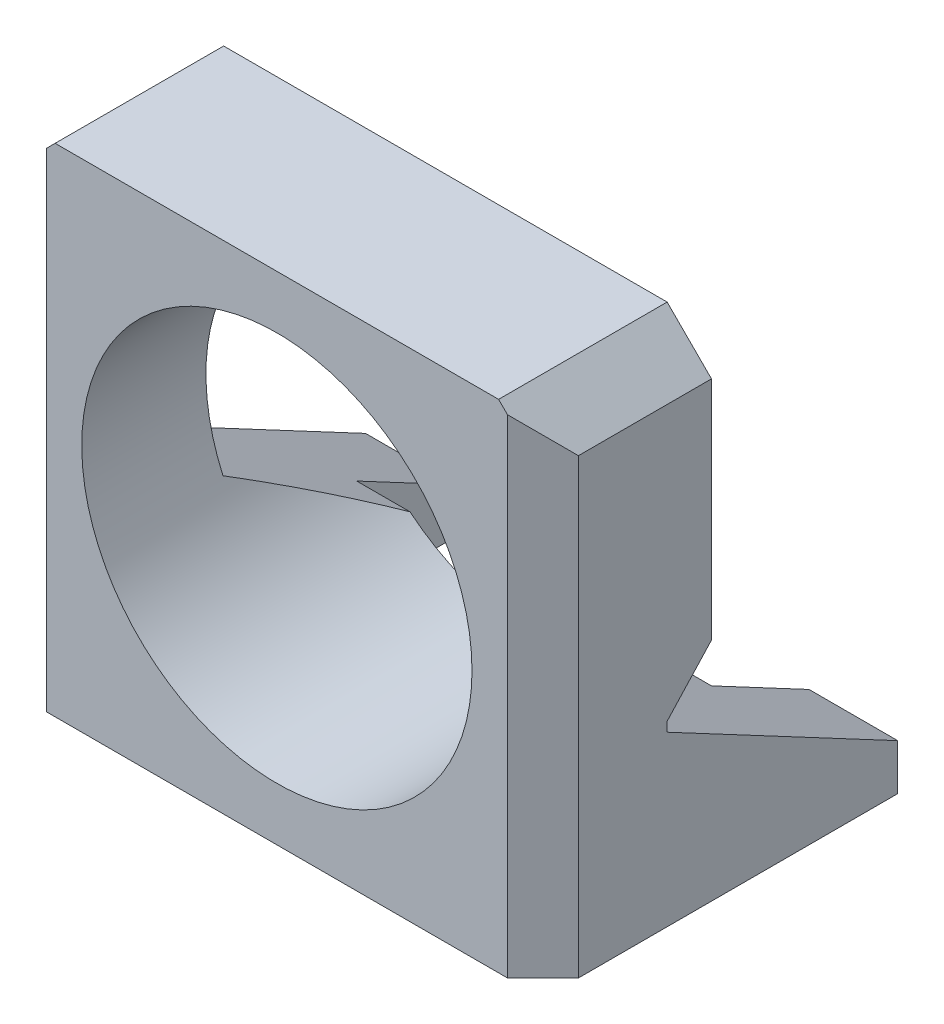
ISO-10303-21;
HEADER;
FILE_DESCRIPTION(('STEP AP214'),'2;1');
FILE_NAME('part.step','',(''),(''),'','','');
FILE_SCHEMA(('AUTOMOTIVE_DESIGN { 1 0 10303 214 1 1 1 1 }'));
ENDSEC;
DATA;
#1=APPLICATION_CONTEXT('core data for automotive mechanical design processes');
#2=APPLICATION_PROTOCOL_DEFINITION('international standard','automotive_design',2000,#1);
#3=PRODUCT_CONTEXT('',#1,'mechanical');
#4=PRODUCT('Part','Part','',(#3));
#5=PRODUCT_RELATED_PRODUCT_CATEGORY('part','',(#4));
#6=PRODUCT_DEFINITION_FORMATION('','',#4);
#7=PRODUCT_DEFINITION_CONTEXT('part definition',#1,'design');
#8=PRODUCT_DEFINITION('design','',#6,#7);
#9=PRODUCT_DEFINITION_SHAPE('','',#8);
#10=(LENGTH_UNIT() NAMED_UNIT(*) SI_UNIT(.MILLI.,.METRE.));
#11=(NAMED_UNIT(*) PLANE_ANGLE_UNIT() SI_UNIT($,.RADIAN.));
#12=(NAMED_UNIT(*) SI_UNIT($,.STERADIAN.) SOLID_ANGLE_UNIT());
#13=UNCERTAINTY_MEASURE_WITH_UNIT(LENGTH_MEASURE(1.E-05),#10,'distance_accuracy_value','');
#14=(GEOMETRIC_REPRESENTATION_CONTEXT(3) GLOBAL_UNCERTAINTY_ASSIGNED_CONTEXT((#13)) GLOBAL_UNIT_ASSIGNED_CONTEXT((#10,
#11,#12)) REPRESENTATION_CONTEXT('',''));
#15=CARTESIAN_POINT('',(0.,0.,0.));
#16=DIRECTION('',(0.,0.,1.));
#17=DIRECTION('',(1.,0.,0.));
#18=AXIS2_PLACEMENT_3D('',#15,#16,#17);
#19=CARTESIAN_POINT('',(-15.,-11.5,-13.1650852574246));
#20=DIRECTION('',(0.,0.882947592858929,-0.469471562785888));
#21=DIRECTION('',(-1.,0.,0.));
#22=AXIS2_PLACEMENT_3D('',#19,#20,#21);
#23=PLANE('',#22);
#24=DIRECTION('',(-1.,0.,0.));
#25=VECTOR('',#24,1.);
#26=CARTESIAN_POINT('',(-15.,-8.48782073746096,-7.5));
#27=LINE('',#26,#25);
#28=CARTESIAN_POINT('',(6.99692068904083,-8.48782073746097,-7.50000000000001));
#29=VERTEX_POINT('',#28);
#30=CARTESIAN_POINT('',(10.,-8.48782073746096,-7.50000000000001));
#31=VERTEX_POINT('',#30);
#32=EDGE_CURVE('E292',#29,#31,#27,.F.);
#33=ORIENTED_EDGE('',*,*,#32,.F.);
#34=CARTESIAN_POINT('',(0.,0.,8.46326909405839));
#35=DIRECTION('',(0.,0.882947592858929,-0.469471562785888));
#36=DIRECTION('',(0.,-0.469471562785888,-0.882947592858929));
#37=AXIS2_PLACEMENT_3D('',#34,#35,#36);
#38=ELLIPSE('',#37,23.4305991500848,11.);
#39=CARTESIAN_POINT('',(10.0374299499424,-4.49999999999991,0.));
#40=VERTEX_POINT('',#39);
#41=EDGE_CURVE('E302',#40,#29,#38,.T.);
#42=ORIENTED_EDGE('',*,*,#41,.F.);
#43=DIRECTION('',(-1.,0.,0.));
#44=VECTOR('',#43,1.);
#45=CARTESIAN_POINT('',(-15.,-4.49999999999991,0.));
#46=LINE('',#45,#44);
#47=CARTESIAN_POINT('',(15.,-4.4999999999999,0.));
#48=VERTEX_POINT('',#47);
#49=EDGE_CURVE('E282',#48,#40,#46,.T.);
#50=ORIENTED_EDGE('',*,*,#49,.F.);
#51=DIRECTION('',(0.,-0.469471562785888,-0.882947592858929));
#52=VECTOR('',#51,1.);
#53=CARTESIAN_POINT('',(15.,1.92808827617668,12.0894757425879));
#54=LINE('',#53,#52);
#55=CARTESIAN_POINT('',(15.,-11.4122226115991,-13.));
#56=VERTEX_POINT('',#55);
#57=EDGE_CURVE('E300',#56,#48,#54,.F.);
#58=ORIENTED_EDGE('',*,*,#57,.F.);
#59=DIRECTION('',(-1.,0.,0.));
#60=VECTOR('',#59,1.);
#61=CARTESIAN_POINT('',(-15.,-11.4122226115991,-13.));
#62=LINE('',#61,#60);
#63=CARTESIAN_POINT('',(10.,-11.4122226115991,-13.));
#64=VERTEX_POINT('',#63);
#65=EDGE_CURVE('E297',#64,#56,#62,.F.);
#66=ORIENTED_EDGE('',*,*,#65,.F.);
#67=DIRECTION('',(0.,0.469471562785888,0.882947592858929));
#68=VECTOR('',#67,1.);
#69=CARTESIAN_POINT('',(10.,-11.9825779301216,-14.0726823421964));
#70=LINE('',#69,#68);
#71=EDGE_CURVE('E294',#31,#64,#70,.F.);
#72=ORIENTED_EDGE('',*,*,#71,.F.);
#73=EDGE_LOOP('',(#33,#42,#50,#58,#66,#72));
#74=FACE_BOUND('',#73,.T.);
#75=ADVANCED_FACE('F47',(#74),#23,.T.);
#76=CARTESIAN_POINT('',(0.,0.,0.));
#77=DIRECTION('',(0.,0.,1.));
#78=DIRECTION('',(1.,0.,0.));
#79=AXIS2_PLACEMENT_3D('',#76,#77,#78);
#80=PLANE('',#79);
#81=DIRECTION('',(0.,1.,0.));
#82=VECTOR('',#81,1.);
#83=CARTESIAN_POINT('',(15.,11.5,0.));
#84=LINE('',#83,#82);
#85=CARTESIAN_POINT('',(15.,-3.96641422651259,0.));
#86=VERTEX_POINT('',#85);
#87=EDGE_CURVE('E190',#48,#86,#84,.T.);
#88=ORIENTED_EDGE('',*,*,#87,.F.);
#89=ORIENTED_EDGE('',*,*,#49,.T.);
#90=CARTESIAN_POINT('',(0.,0.,0.));
#91=DIRECTION('',(0.,0.,1.));
#92=DIRECTION('',(1.,0.,0.));
#93=AXIS2_PLACEMENT_3D('',#90,#91,#92);
#94=CIRCLE('',#93,11.);
#95=CARTESIAN_POINT('',(10.7829919794879,-2.17418581779493,0.));
#96=VERTEX_POINT('',#95);
#97=EDGE_CURVE('E340',#40,#96,#94,.T.);
#98=ORIENTED_EDGE('',*,*,#97,.T.);
#99=DIRECTION('',(0.920330918458475,-0.391140640344852,0.));
#100=VECTOR('',#99,1.);
#101=CARTESIAN_POINT('',(14.0221483991379,-3.55082729614618,0.));
#102=LINE('',#101,#100);
#103=EDGE_CURVE('E274',#96,#86,#102,.T.);
#104=ORIENTED_EDGE('',*,*,#103,.T.);
#105=EDGE_LOOP('',(#88,#89,#98,#104));
#106=FACE_BOUND('',#105,.T.);
#107=ADVANCED_FACE('F420',(#106),#80,.F.);
#108=CARTESIAN_POINT('',(-9.04891222726823,6.25437347007641,0.));
#109=VERTEX_POINT('',#108);
#110=CARTESIAN_POINT('',(-10.0374299499424,-4.49999999999991,0.));
#111=VERTEX_POINT('',#110);
#112=EDGE_CURVE('E353',#109,#111,#94,.T.);
#113=ORIENTED_EDGE('',*,*,#112,.T.);
#114=DIRECTION('',(-1.,0.,0.));
#115=VECTOR('',#114,1.);
#116=CARTESIAN_POINT('',(-15.,-4.49999999999991,0.));
#117=LINE('',#116,#115);
#118=CARTESIAN_POINT('',(-15.,-4.4999999999999,0.));
#119=VERTEX_POINT('',#118);
#120=EDGE_CURVE('E280',#111,#119,#117,.T.);
#121=ORIENTED_EDGE('',*,*,#120,.T.);
#122=DIRECTION('',(0.,-1.,0.));
#123=VECTOR('',#122,1.);
#124=CARTESIAN_POINT('',(-15.,11.5,0.));
#125=LINE('',#124,#123);
#126=CARTESIAN_POINT('',(-15.,8.78358577348742,0.));
#127=VERTEX_POINT('',#126);
#128=EDGE_CURVE('E315',#127,#119,#125,.T.);
#129=ORIENTED_EDGE('',*,*,#128,.F.);
#130=DIRECTION('',(0.920330918458475,-0.391140640344852,0.));
#131=VECTOR('',#130,1.);
#132=CARTESIAN_POINT('',(-8.27869643902787,5.92703176007426,0.));
#133=LINE('',#132,#131);
#134=EDGE_CURVE('E272',#127,#109,#133,.T.);
#135=ORIENTED_EDGE('',*,*,#134,.T.);
#136=EDGE_LOOP('',(#113,#121,#129,#135));
#137=FACE_BOUND('',#136,.T.);
#138=ADVANCED_FACE('F426',(#137),#80,.F.);
#139=CARTESIAN_POINT('',(0.,0.,7.));
#140=DIRECTION('',(0.,0.,1.));
#141=DIRECTION('',(1.,0.,0.));
#142=AXIS2_PLACEMENT_3D('',#139,#140,#141);
#143=PLANE('',#142);
#144=DIRECTION('',(-0.707106781186548,-0.707106781186548,0.));
#145=VECTOR('',#144,1.);
#146=CARTESIAN_POINT('',(-15.,11.5,7.));
#147=LINE('',#146,#145);
#148=CARTESIAN_POINT('',(-12.5,14.,7.));
#149=VERTEX_POINT('',#148);
#150=CARTESIAN_POINT('',(-13.,13.5,7.));
#151=VERTEX_POINT('',#150);
#152=EDGE_CURVE('E236',#149,#151,#147,.T.);
#153=ORIENTED_EDGE('',*,*,#152,.T.);
#154=DIRECTION('',(0.,-1.,0.));
#155=VECTOR('',#154,1.);
#156=CARTESIAN_POINT('',(-13.,-14.,7.));
#157=LINE('',#156,#155);
#158=CARTESIAN_POINT('',(-13.,-14.,7.));
#159=VERTEX_POINT('',#158);
#160=EDGE_CURVE('E258',#151,#159,#157,.T.);
#161=ORIENTED_EDGE('',*,*,#160,.T.);
#162=DIRECTION('',(1.,0.,0.));
#163=VECTOR('',#162,1.);
#164=CARTESIAN_POINT('',(-15.,-14.,7.));
#165=LINE('',#164,#163);
#166=CARTESIAN_POINT('',(13.,-14.,7.));
#167=VERTEX_POINT('',#166);
#168=EDGE_CURVE('E359',#159,#167,#165,.T.);
#169=ORIENTED_EDGE('',*,*,#168,.T.);
#170=DIRECTION('',(0.,1.,0.));
#171=VECTOR('',#170,1.);
#172=CARTESIAN_POINT('',(13.,11.5,7.));
#173=LINE('',#172,#171);
#174=CARTESIAN_POINT('',(13.,13.5,7.));
#175=VERTEX_POINT('',#174);
#176=EDGE_CURVE('E248',#167,#175,#173,.T.);
#177=ORIENTED_EDGE('',*,*,#176,.T.);
#178=DIRECTION('',(-0.707106781186548,0.707106781186548,0.));
#179=VECTOR('',#178,1.);
#180=CARTESIAN_POINT('',(12.5,14.,7.));
#181=LINE('',#180,#179);
#182=CARTESIAN_POINT('',(12.5,14.,7.));
#183=VERTEX_POINT('',#182);
#184=EDGE_CURVE('E354',#175,#183,#181,.T.);
#185=ORIENTED_EDGE('',*,*,#184,.T.);
#186=DIRECTION('',(-1.,0.,0.));
#187=VECTOR('',#186,1.);
#188=CARTESIAN_POINT('',(-12.5,14.,7.));
#189=LINE('',#188,#187);
#190=EDGE_CURVE('E356',#183,#149,#189,.T.);
#191=ORIENTED_EDGE('',*,*,#190,.T.);
#192=EDGE_LOOP('',(#153,#161,#169,#177,#185,#191));
#193=FACE_BOUND('',#192,.T.);
#194=CARTESIAN_POINT('',(0.,0.,7.));
#195=DIRECTION('',(0.,0.,1.));
#196=DIRECTION('',(1.,0.,0.));
#197=AXIS2_PLACEMENT_3D('',#194,#195,#196);
#198=CIRCLE('',#197,11.);
#199=CARTESIAN_POINT('',(11.,0.,7.));
#200=VERTEX_POINT('',#199);
#201=EDGE_CURVE('E347',#200,#200,#198,.T.);
#202=ORIENTED_EDGE('',*,*,#201,.F.);
#203=EDGE_LOOP('',(#202));
#204=FACE_BOUND('',#203,.T.);
#205=ADVANCED_FACE('F372',(#193,#204),#143,.T.);
#206=CARTESIAN_POINT('',(15.,11.5,7.));
#207=DIRECTION('',(-1.,0.,0.));
#208=DIRECTION('',(0.,-1.,0.));
#209=AXIS2_PLACEMENT_3D('',#206,#207,#208);
#210=PLANE('',#209);
#211=DIRECTION('',(0.,0.,-1.));
#212=VECTOR('',#211,1.);
#213=CARTESIAN_POINT('',(15.,11.5,7.));
#214=LINE('',#213,#212);
#215=CARTESIAN_POINT('',(15.,11.5,5.));
#216=VERTEX_POINT('',#215);
#217=CARTESIAN_POINT('',(15.,11.5,-2.5));
#218=VERTEX_POINT('',#217);
#219=EDGE_CURVE('E241',#216,#218,#214,.T.);
#220=ORIENTED_EDGE('',*,*,#219,.F.);
#221=DIRECTION('',(0.,-1.,0.));
#222=VECTOR('',#221,1.);
#223=CARTESIAN_POINT('',(15.,-14.,5.));
#224=LINE('',#223,#222);
#225=CARTESIAN_POINT('',(15.,-14.,5.));
#226=VERTEX_POINT('',#225);
#227=EDGE_CURVE('E253',#216,#226,#224,.T.);
#228=ORIENTED_EDGE('',*,*,#227,.T.);
#229=DIRECTION('',(0.,0.,-1.));
#230=VECTOR('',#229,1.);
#231=CARTESIAN_POINT('',(15.,-14.,7.));
#232=LINE('',#231,#230);
#233=CARTESIAN_POINT('',(15.,-14.,-13.));
#234=VERTEX_POINT('',#233);
#235=EDGE_CURVE('E361',#226,#234,#232,.T.);
#236=ORIENTED_EDGE('',*,*,#235,.T.);
#237=DIRECTION('',(0.,1.,0.));
#238=VECTOR('',#237,1.);
#239=CARTESIAN_POINT('',(15.,-14.,-13.));
#240=LINE('',#239,#238);
#241=EDGE_CURVE('E344',#234,#56,#240,.T.);
#242=ORIENTED_EDGE('',*,*,#241,.T.);
#243=ORIENTED_EDGE('',*,*,#57,.T.);
#244=ORIENTED_EDGE('',*,*,#87,.T.);
#245=DIRECTION('',(0.,-0.73580967544278,0.677188394410884));
#246=VECTOR('',#245,1.);
#247=CARTESIAN_POINT('',(15.,0.91937560986056,-4.49654344750437));
#248=LINE('',#247,#246);
#249=CARTESIAN_POINT('',(15.,-1.25,-2.5));
#250=VERTEX_POINT('',#249);
#251=EDGE_CURVE('E184',#86,#250,#248,.F.);
#252=ORIENTED_EDGE('',*,*,#251,.T.);
#253=DIRECTION('',(0.,-1.,0.));
#254=VECTOR('',#253,1.);
#255=CARTESIAN_POINT('',(15.,11.5,-2.5));
#256=LINE('',#255,#254);
#257=EDGE_CURVE('E188',#218,#250,#256,.T.);
#258=ORIENTED_EDGE('',*,*,#257,.F.);
#259=EDGE_LOOP('',(#220,#228,#236,#242,#243,#244,#252,#258));
#260=FACE_BOUND('',#259,.T.);
#261=ADVANCED_FACE('F187',(#260),#210,.F.);
#262=CARTESIAN_POINT('',(12.5,14.,7.));
#263=DIRECTION('',(-0.707106781186547,-0.707106781186547,0.));
#264=DIRECTION('',(0.707106781186548,-0.707106781186548,0.));
#265=AXIS2_PLACEMENT_3D('',#262,#263,#264);
#266=PLANE('',#265);
#267=ORIENTED_EDGE('',*,*,#184,.F.);
#268=DIRECTION('',(0.577350269189625,-0.577350269189625,-0.577350269189627));
#269=VECTOR('',#268,1.);
#270=CARTESIAN_POINT('',(17.5,9.00000000000001,2.5));
#271=LINE('',#270,#269);
#272=EDGE_CURVE('E251',#175,#216,#271,.T.);
#273=ORIENTED_EDGE('',*,*,#272,.T.);
#274=ORIENTED_EDGE('',*,*,#219,.T.);
#275=DIRECTION('',(0.707106781186548,-0.707106781186548,0.));
#276=VECTOR('',#275,1.);
#277=CARTESIAN_POINT('',(12.5,14.,-2.5));
#278=LINE('',#277,#276);
#279=CARTESIAN_POINT('',(12.5,14.,-2.5));
#280=VERTEX_POINT('',#279);
#281=EDGE_CURVE('E206',#280,#218,#278,.T.);
#282=ORIENTED_EDGE('',*,*,#281,.F.);
#283=DIRECTION('',(0.,0.,-1.));
#284=VECTOR('',#283,1.);
#285=CARTESIAN_POINT('',(12.5,14.,7.));
#286=LINE('',#285,#284);
#287=EDGE_CURVE('E239',#183,#280,#286,.T.);
#288=ORIENTED_EDGE('',*,*,#287,.F.);
#289=EDGE_LOOP('',(#267,#273,#274,#282,#288));
#290=FACE_BOUND('',#289,.T.);
#291=ADVANCED_FACE('F379',(#290),#266,.F.);
#292=CARTESIAN_POINT('',(-12.5,14.,7.));
#293=DIRECTION('',(0.,-1.,0.));
#294=DIRECTION('',(0.,0.,-1.));
#295=AXIS2_PLACEMENT_3D('',#292,#293,#294);
#296=PLANE('',#295);
#297=ORIENTED_EDGE('',*,*,#287,.T.);
#298=DIRECTION('',(1.,0.,0.));
#299=VECTOR('',#298,1.);
#300=CARTESIAN_POINT('',(-12.5,14.,-2.5));
#301=LINE('',#300,#299);
#302=CARTESIAN_POINT('',(-12.5,14.,-2.5));
#303=VERTEX_POINT('',#302);
#304=EDGE_CURVE('E217',#303,#280,#301,.T.);
#305=ORIENTED_EDGE('',*,*,#304,.F.);
#306=DIRECTION('',(0.,0.,-1.));
#307=VECTOR('',#306,1.);
#308=CARTESIAN_POINT('',(-12.5,14.,7.));
#309=LINE('',#308,#307);
#310=EDGE_CURVE('E234',#149,#303,#309,.T.);
#311=ORIENTED_EDGE('',*,*,#310,.F.);
#312=ORIENTED_EDGE('',*,*,#190,.F.);
#313=EDGE_LOOP('',(#297,#305,#311,#312));
#314=FACE_BOUND('',#313,.T.);
#315=ADVANCED_FACE('F376',(#314),#296,.F.);
#316=CARTESIAN_POINT('',(-15.,11.5,7.));
#317=DIRECTION('',(0.707106781186547,-0.707106781186547,0.));
#318=DIRECTION('',(0.707106781186548,0.707106781186548,0.));
#319=AXIS2_PLACEMENT_3D('',#316,#317,#318);
#320=PLANE('',#319);
#321=DIRECTION('',(0.,0.,-1.));
#322=VECTOR('',#321,1.);
#323=CARTESIAN_POINT('',(-15.,11.5,7.));
#324=LINE('',#323,#322);
#325=CARTESIAN_POINT('',(-15.,11.5,4.99999999999998));
#326=VERTEX_POINT('',#325);
#327=CARTESIAN_POINT('',(-15.,11.5,-2.49999999999999));
#328=VERTEX_POINT('',#327);
#329=EDGE_CURVE('E230',#326,#328,#324,.T.);
#330=ORIENTED_EDGE('',*,*,#329,.F.);
#331=DIRECTION('',(0.577350269189625,0.577350269189625,0.577350269189627));
#332=VECTOR('',#331,1.);
#333=CARTESIAN_POINT('',(-17.5,9.00000000000002,2.49999999999999));
#334=LINE('',#333,#332);
#335=EDGE_CURVE('E265',#326,#151,#334,.T.);
#336=ORIENTED_EDGE('',*,*,#335,.T.);
#337=ORIENTED_EDGE('',*,*,#152,.F.);
#338=ORIENTED_EDGE('',*,*,#310,.T.);
#339=DIRECTION('',(0.707106781186548,0.707106781186548,0.));
#340=VECTOR('',#339,1.);
#341=CARTESIAN_POINT('',(-15.,11.5,-2.5));
#342=LINE('',#341,#340);
#343=EDGE_CURVE('E213',#328,#303,#342,.T.);
#344=ORIENTED_EDGE('',*,*,#343,.F.);
#345=EDGE_LOOP('',(#330,#336,#337,#338,#344));
#346=FACE_BOUND('',#345,.T.);
#347=ADVANCED_FACE('F229',(#346),#320,.F.);
#348=CARTESIAN_POINT('',(-15.,11.5,7.));
#349=DIRECTION('',(1.,0.,0.));
#350=DIRECTION('',(0.,1.,0.));
#351=AXIS2_PLACEMENT_3D('',#348,#349,#350);
#352=PLANE('',#351);
#353=DIRECTION('',(0.,0.,-1.));
#354=VECTOR('',#353,1.);
#355=CARTESIAN_POINT('',(-15.,-14.,7.));
#356=LINE('',#355,#354);
#357=CARTESIAN_POINT('',(-15.,-14.,4.99999999999998));
#358=VERTEX_POINT('',#357);
#359=CARTESIAN_POINT('',(-15.,-14.,-13.));
#360=VERTEX_POINT('',#359);
#361=EDGE_CURVE('E243',#358,#360,#356,.T.);
#362=ORIENTED_EDGE('',*,*,#361,.F.);
#363=DIRECTION('',(0.,1.,0.));
#364=VECTOR('',#363,1.);
#365=CARTESIAN_POINT('',(-15.,11.5,4.99999999999998));
#366=LINE('',#365,#364);
#367=EDGE_CURVE('E263',#358,#326,#366,.T.);
#368=ORIENTED_EDGE('',*,*,#367,.T.);
#369=ORIENTED_EDGE('',*,*,#329,.T.);
#370=DIRECTION('',(0.,0.73580967544278,-0.677188394410884));
#371=VECTOR('',#370,1.);
#372=CARTESIAN_POINT('',(-15.,6.76632315930166,1.85654915448553));
#373=LINE('',#372,#371);
#374=EDGE_CURVE('E195',#328,#127,#373,.F.);
#375=ORIENTED_EDGE('',*,*,#374,.T.);
#376=ORIENTED_EDGE('',*,*,#128,.T.);
#377=DIRECTION('',(0.,0.469471562785888,0.882947592858929));
#378=VECTOR('',#377,1.);
#379=CARTESIAN_POINT('',(-15.,1.92808827617668,12.0894757425879));
#380=LINE('',#379,#378);
#381=CARTESIAN_POINT('',(-15.,-11.4122226115991,-13.));
#382=VERTEX_POINT('',#381);
#383=EDGE_CURVE('E56',#119,#382,#380,.F.);
#384=ORIENTED_EDGE('',*,*,#383,.T.);
#385=DIRECTION('',(0.,1.,0.));
#386=VECTOR('',#385,1.);
#387=CARTESIAN_POINT('',(-15.,-14.,-13.));
#388=LINE('',#387,#386);
#389=EDGE_CURVE('E312',#360,#382,#388,.T.);
#390=ORIENTED_EDGE('',*,*,#389,.F.);
#391=EDGE_LOOP('',(#362,#368,#369,#375,#376,#384,#390));
#392=FACE_BOUND('',#391,.T.);
#393=ADVANCED_FACE('F311',(#392),#352,.F.);
#394=CARTESIAN_POINT('',(-15.,-14.,7.));
#395=DIRECTION('',(0.,1.,0.));
#396=DIRECTION('',(0.,0.,1.));
#397=AXIS2_PLACEMENT_3D('',#394,#395,#396);
#398=PLANE('',#397);
#399=ORIENTED_EDGE('',*,*,#168,.F.);
#400=DIRECTION('',(-0.707106781186546,0.,-0.707106781186549));
#401=VECTOR('',#400,1.);
#402=CARTESIAN_POINT('',(-13.,-14.,7.));
#403=LINE('',#402,#401);
#404=EDGE_CURVE('E261',#159,#358,#403,.T.);
#405=ORIENTED_EDGE('',*,*,#404,.T.);
#406=ORIENTED_EDGE('',*,*,#361,.T.);
#407=DIRECTION('',(1.,0.,0.));
#408=VECTOR('',#407,1.);
#409=CARTESIAN_POINT('',(-15.,-14.,-13.));
#410=LINE('',#409,#408);
#411=CARTESIAN_POINT('',(-10.,-14.,-13.));
#412=VERTEX_POINT('',#411);
#413=EDGE_CURVE('E325',#360,#412,#410,.T.);
#414=ORIENTED_EDGE('',*,*,#413,.T.);
#415=DIRECTION('',(0.,0.,1.));
#416=VECTOR('',#415,1.);
#417=CARTESIAN_POINT('',(-10.,-14.,-13.));
#418=LINE('',#417,#416);
#419=CARTESIAN_POINT('',(-10.,-14.,-7.50000000000001));
#420=VERTEX_POINT('',#419);
#421=EDGE_CURVE('E337',#412,#420,#418,.T.);
#422=ORIENTED_EDGE('',*,*,#421,.T.);
#423=DIRECTION('',(1.,0.,0.));
#424=VECTOR('',#423,1.);
#425=CARTESIAN_POINT('',(0.,-14.,-7.50000000000001));
#426=LINE('',#425,#424);
#427=CARTESIAN_POINT('',(10.,-14.,-7.50000000000001));
#428=VERTEX_POINT('',#427);
#429=EDGE_CURVE('E380',#420,#428,#426,.T.);
#430=ORIENTED_EDGE('',*,*,#429,.T.);
#431=DIRECTION('',(0.,0.,1.));
#432=VECTOR('',#431,1.);
#433=CARTESIAN_POINT('',(10.,-14.,-13.));
#434=LINE('',#433,#432);
#435=CARTESIAN_POINT('',(10.,-14.,-13.));
#436=VERTEX_POINT('',#435);
#437=EDGE_CURVE('E341',#436,#428,#434,.T.);
#438=ORIENTED_EDGE('',*,*,#437,.F.);
#439=DIRECTION('',(-1.,0.,0.));
#440=VECTOR('',#439,1.);
#441=CARTESIAN_POINT('',(15.,-14.,-13.));
#442=LINE('',#441,#440);
#443=EDGE_CURVE('E326',#234,#436,#442,.T.);
#444=ORIENTED_EDGE('',*,*,#443,.F.);
#445=ORIENTED_EDGE('',*,*,#235,.F.);
#446=DIRECTION('',(-0.707106781186546,0.,0.707106781186549));
#447=VECTOR('',#446,1.);
#448=CARTESIAN_POINT('',(13.,-14.,7.));
#449=LINE('',#448,#447);
#450=EDGE_CURVE('E255',#226,#167,#449,.T.);
#451=ORIENTED_EDGE('',*,*,#450,.T.);
#452=EDGE_LOOP('',(#399,#405,#406,#414,#422,#430,#438,#444,#445,#451));
#453=FACE_BOUND('',#452,.T.);
#454=ADVANCED_FACE('F366',(#453),#398,.F.);
#455=CARTESIAN_POINT('',(0.,0.,7.));
#456=DIRECTION('',(0.,0.,-1.));
#457=DIRECTION('',(-1.,0.,0.));
#458=AXIS2_PLACEMENT_3D('',#455,#456,#457);
#459=CYLINDRICAL_SURFACE('',#458,11.);
#460=ORIENTED_EDGE('',*,*,#201,.T.);
#461=EDGE_LOOP('',(#460));
#462=FACE_BOUND('',#461,.T.);
#463=ORIENTED_EDGE('',*,*,#41,.T.);
#464=CARTESIAN_POINT('',(0.,0.,-7.50000000000001));
#465=DIRECTION('',(0.,0.,-1.));
#466=DIRECTION('',(-1.,0.,0.));
#467=AXIS2_PLACEMENT_3D('',#464,#465,#466);
#468=CIRCLE('',#467,11.);
#469=CARTESIAN_POINT('',(-6.99692068904083,-8.48782073746096,-7.50000000000001));
#470=VERTEX_POINT('',#469);
#471=EDGE_CURVE('E11',#29,#470,#468,.T.);
#472=ORIENTED_EDGE('',*,*,#471,.T.);
#473=EDGE_CURVE('E303',#470,#111,#38,.T.);
#474=ORIENTED_EDGE('',*,*,#473,.T.);
#475=ORIENTED_EDGE('',*,*,#112,.F.);
#476=CARTESIAN_POINT('',(0.,0.,2.21669595709969));
#477=DIRECTION('',(-0.276578199185493,-0.65077223337763,-0.707106781186548));
#478=DIRECTION('',(0.276578199185493,0.650772233377631,-0.707106781186547));
#479=AXIS2_PLACEMENT_3D('',#476,#477,#478);
#480=ELLIPSE('',#479,15.556349186104,11.);
#481=CARTESIAN_POINT('',(-7.30084483816573,8.22785905622044,-2.5));
#482=VERTEX_POINT('',#481);
#483=EDGE_CURVE('E278',#109,#482,#480,.T.);
#484=ORIENTED_EDGE('',*,*,#483,.T.);
#485=DIRECTION('',(0.,0.,-1.));
#486=VECTOR('',#485,1.);
#487=CARTESIAN_POINT('',(-7.30084483816574,8.22785905622044,0.));
#488=LINE('',#487,#486);
#489=CARTESIAN_POINT('',(-7.30084483816574,8.22785905622044,0.));
#490=VERTEX_POINT('',#489);
#491=EDGE_CURVE('E267',#490,#482,#488,.T.);
#492=ORIENTED_EDGE('',*,*,#491,.F.);
#493=CARTESIAN_POINT('',(10.9906277921096,0.453983188353408,0.));
#494=VERTEX_POINT('',#493);
#495=EDGE_CURVE('E350',#494,#490,#94,.T.);
#496=ORIENTED_EDGE('',*,*,#495,.F.);
#497=DIRECTION('',(0.,0.,-1.));
#498=VECTOR('',#497,1.);
#499=CARTESIAN_POINT('',(10.9906277921096,0.453983188353409,-2.5));
#500=LINE('',#499,#498);
#501=CARTESIAN_POINT('',(10.9906277921096,0.453983188353409,-2.5));
#502=VERTEX_POINT('',#501);
#503=EDGE_CURVE('E270',#502,#494,#500,.F.);
#504=ORIENTED_EDGE('',*,*,#503,.F.);
#505=CARTESIAN_POINT('',(0.,0.,2.21669595709968));
#506=DIRECTION('',(-0.276578199185493,-0.65077223337763,-0.707106781186548));
#507=DIRECTION('',(0.276578199185493,0.650772233377631,-0.707106781186547));
#508=AXIS2_PLACEMENT_3D('',#505,#506,#507);
#509=ELLIPSE('',#508,15.556349186104,11.);
#510=EDGE_CURVE('E196',#502,#96,#509,.T.);
#511=ORIENTED_EDGE('',*,*,#510,.T.);
#512=ORIENTED_EDGE('',*,*,#97,.F.);
#513=EDGE_LOOP('',(#463,#472,#474,#475,#484,#492,#496,#504,#511,#512));
#514=FACE_BOUND('',#513,.T.);
#515=ADVANCED_FACE('F453',(#462,#514),#459,.F.);
#516=CARTESIAN_POINT('',(10.,-14.,-13.));
#517=DIRECTION('',(1.,0.,0.));
#518=DIRECTION('',(0.,0.,-1.));
#519=AXIS2_PLACEMENT_3D('',#516,#517,#518);
#520=PLANE('',#519);
#521=ORIENTED_EDGE('',*,*,#437,.T.);
#522=DIRECTION('',(0.,-1.,0.));
#523=VECTOR('',#522,1.);
#524=CARTESIAN_POINT('',(10.,9.86000936329383,-7.50000000000001));
#525=LINE('',#524,#523);
#526=EDGE_CURVE('E383',#31,#428,#525,.T.);
#527=ORIENTED_EDGE('',*,*,#526,.F.);
#528=ORIENTED_EDGE('',*,*,#71,.T.);
#529=DIRECTION('',(0.,1.,0.));
#530=VECTOR('',#529,1.);
#531=CARTESIAN_POINT('',(10.,-14.,-13.));
#532=LINE('',#531,#530);
#533=EDGE_CURVE('E330',#436,#64,#532,.T.);
#534=ORIENTED_EDGE('',*,*,#533,.F.);
#535=EDGE_LOOP('',(#521,#527,#528,#534));
#536=FACE_BOUND('',#535,.T.);
#537=ADVANCED_FACE('F394',(#536),#520,.F.);
#538=CARTESIAN_POINT('',(0.,0.,-13.));
#539=DIRECTION('',(0.,0.,-1.));
#540=DIRECTION('',(-1.,0.,0.));
#541=AXIS2_PLACEMENT_3D('',#538,#539,#540);
#542=PLANE('',#541);
#543=ORIENTED_EDGE('',*,*,#443,.T.);
#544=ORIENTED_EDGE('',*,*,#533,.T.);
#545=ORIENTED_EDGE('',*,*,#65,.T.);
#546=ORIENTED_EDGE('',*,*,#241,.F.);
#547=EDGE_LOOP('',(#543,#544,#545,#546));
#548=FACE_BOUND('',#547,.T.);
#549=ADVANCED_FACE('F399',(#548),#542,.T.);
#550=CARTESIAN_POINT('',(-10.,-14.,-13.));
#551=DIRECTION('',(1.,0.,0.));
#552=DIRECTION('',(0.,0.,-1.));
#553=AXIS2_PLACEMENT_3D('',#550,#551,#552);
#554=PLANE('',#553);
#555=DIRECTION('',(0.,-1.,0.));
#556=VECTOR('',#555,1.);
#557=CARTESIAN_POINT('',(-10.,9.86000936329383,-7.50000000000001));
#558=LINE('',#557,#556);
#559=CARTESIAN_POINT('',(-10.,-8.48782073746096,-7.50000000000001));
#560=VERTEX_POINT('',#559);
#561=EDGE_CURVE('E333',#560,#420,#558,.T.);
#562=ORIENTED_EDGE('',*,*,#561,.T.);
#563=ORIENTED_EDGE('',*,*,#421,.F.);
#564=DIRECTION('',(0.,1.,0.));
#565=VECTOR('',#564,1.);
#566=CARTESIAN_POINT('',(-10.,-14.,-13.));
#567=LINE('',#566,#565);
#568=CARTESIAN_POINT('',(-10.,-11.4122226115991,-13.));
#569=VERTEX_POINT('',#568);
#570=EDGE_CURVE('E323',#412,#569,#567,.T.);
#571=ORIENTED_EDGE('',*,*,#570,.T.);
#572=DIRECTION('',(0.,-0.469471562785888,-0.882947592858929));
#573=VECTOR('',#572,1.);
#574=CARTESIAN_POINT('',(-10.,-11.5,-13.1650852574246));
#575=LINE('',#574,#573);
#576=EDGE_CURVE('E288',#569,#560,#575,.F.);
#577=ORIENTED_EDGE('',*,*,#576,.T.);
#578=EDGE_LOOP('',(#562,#563,#571,#577));
#579=FACE_BOUND('',#578,.T.);
#580=ADVANCED_FACE('F390',(#579),#554,.T.);
#581=CARTESIAN_POINT('',(0.,0.,-13.));
#582=DIRECTION('',(0.,0.,-1.));
#583=DIRECTION('',(-1.,0.,0.));
#584=AXIS2_PLACEMENT_3D('',#581,#582,#583);
#585=PLANE('',#584);
#586=ORIENTED_EDGE('',*,*,#389,.T.);
#587=DIRECTION('',(-1.,0.,0.));
#588=VECTOR('',#587,1.);
#589=CARTESIAN_POINT('',(-15.,-11.4122226115991,-13.));
#590=LINE('',#589,#588);
#591=EDGE_CURVE('E285',#382,#569,#590,.F.);
#592=ORIENTED_EDGE('',*,*,#591,.T.);
#593=ORIENTED_EDGE('',*,*,#570,.F.);
#594=ORIENTED_EDGE('',*,*,#413,.F.);
#595=EDGE_LOOP('',(#586,#592,#593,#594));
#596=FACE_BOUND('',#595,.T.);
#597=ADVANCED_FACE('F322',(#596),#585,.T.);
#598=CARTESIAN_POINT('',(0.,9.86000936329383,-7.50000000000001));
#599=DIRECTION('',(0.,0.,-1.));
#600=DIRECTION('',(-1.,0.,0.));
#601=AXIS2_PLACEMENT_3D('',#598,#599,#600);
#602=PLANE('',#601);
#603=ORIENTED_EDGE('',*,*,#471,.F.);
#604=ORIENTED_EDGE('',*,*,#32,.T.);
#605=ORIENTED_EDGE('',*,*,#526,.T.);
#606=ORIENTED_EDGE('',*,*,#429,.F.);
#607=ORIENTED_EDGE('',*,*,#561,.F.);
#608=EDGE_CURVE('E291',#560,#470,#27,.F.);
#609=ORIENTED_EDGE('',*,*,#608,.T.);
#610=EDGE_LOOP('',(#603,#604,#605,#606,#607,#609));
#611=FACE_BOUND('',#610,.T.);
#612=ADVANCED_FACE('F407',(#611),#602,.T.);
#613=CARTESIAN_POINT('',(13.,0.,7.));
#614=DIRECTION('',(0.707106781186549,0.,0.707106781186546));
#615=DIRECTION('',(0.,-1.,0.));
#616=AXIS2_PLACEMENT_3D('',#613,#614,#615);
#617=PLANE('',#616);
#618=ORIENTED_EDGE('',*,*,#450,.F.);
#619=ORIENTED_EDGE('',*,*,#227,.F.);
#620=ORIENTED_EDGE('',*,*,#272,.F.);
#621=ORIENTED_EDGE('',*,*,#176,.F.);
#622=EDGE_LOOP('',(#618,#619,#620,#621));
#623=FACE_BOUND('',#622,.T.);
#624=ADVANCED_FACE('F405',(#623),#617,.T.);
#625=CARTESIAN_POINT('',(-13.,0.,7.));
#626=DIRECTION('',(-0.707106781186549,0.,0.707106781186546));
#627=DIRECTION('',(0.,1.,0.));
#628=AXIS2_PLACEMENT_3D('',#625,#626,#627);
#629=PLANE('',#628);
#630=ORIENTED_EDGE('',*,*,#335,.F.);
#631=ORIENTED_EDGE('',*,*,#367,.F.);
#632=ORIENTED_EDGE('',*,*,#404,.F.);
#633=ORIENTED_EDGE('',*,*,#160,.F.);
#634=EDGE_LOOP('',(#630,#631,#632,#633));
#635=FACE_BOUND('',#634,.T.);
#636=ADVANCED_FACE('F369',(#635),#629,.T.);
#637=CARTESIAN_POINT('',(0.,0.,0.));
#638=DIRECTION('',(0.,0.,1.));
#639=DIRECTION('',(1.,0.,0.));
#640=AXIS2_PLACEMENT_3D('',#637,#638,#639);
#641=PLANE('',#640);
#642=DIRECTION('',(-0.920330918458474,0.391140640344852,0.));
#643=VECTOR('',#642,1.);
#644=CARTESIAN_POINT('',(15.,-1.25,0.));
#645=LINE('',#644,#643);
#646=EDGE_CURVE('E208',#494,#490,#645,.T.);
#647=ORIENTED_EDGE('',*,*,#646,.F.);
#648=ORIENTED_EDGE('',*,*,#495,.T.);
#649=EDGE_LOOP('',(#647,#648));
#650=FACE_BOUND('',#649,.T.);
#651=ADVANCED_FACE('F413',(#650),#641,.T.);
#652=CARTESIAN_POINT('',(15.,-1.25,-2.5));
#653=DIRECTION('',(0.391140640344852,0.920330918458474,0.));
#654=DIRECTION('',(-0.920330918458475,0.391140640344852,0.));
#655=AXIS2_PLACEMENT_3D('',#652,#653,#654);
#656=PLANE('',#655);
#657=DIRECTION('',(-0.920330918458474,0.391140640344852,0.));
#658=VECTOR('',#657,1.);
#659=CARTESIAN_POINT('',(15.,-1.25,-2.5));
#660=LINE('',#659,#658);
#661=EDGE_CURVE('E214',#502,#482,#660,.T.);
#662=ORIENTED_EDGE('',*,*,#661,.F.);
#663=ORIENTED_EDGE('',*,*,#503,.T.);
#664=ORIENTED_EDGE('',*,*,#646,.T.);
#665=ORIENTED_EDGE('',*,*,#491,.T.);
#666=EDGE_LOOP('',(#662,#663,#664,#665));
#667=FACE_BOUND('',#666,.T.);
#668=ADVANCED_FACE('F457',(#667),#656,.F.);
#669=CARTESIAN_POINT('',(0.,0.,-2.5));
#670=DIRECTION('',(0.,0.,1.));
#671=DIRECTION('',(1.,0.,0.));
#672=AXIS2_PLACEMENT_3D('',#669,#670,#671);
#673=PLANE('',#672);
#674=ORIENTED_EDGE('',*,*,#257,.T.);
#675=EDGE_CURVE('E203',#250,#502,#660,.T.);
#676=ORIENTED_EDGE('',*,*,#675,.T.);
#677=ORIENTED_EDGE('',*,*,#661,.T.);
#678=EDGE_CURVE('E207',#482,#328,#660,.T.);
#679=ORIENTED_EDGE('',*,*,#678,.T.);
#680=ORIENTED_EDGE('',*,*,#343,.T.);
#681=ORIENTED_EDGE('',*,*,#304,.T.);
#682=ORIENTED_EDGE('',*,*,#281,.T.);
#683=EDGE_LOOP('',(#674,#676,#677,#679,#680,#681,#682));
#684=FACE_BOUND('',#683,.T.);
#685=ADVANCED_FACE('F201',(#684),#673,.F.);
#686=CARTESIAN_POINT('',(15.,-1.25,-2.5));
#687=DIRECTION('',(-0.276578199185493,-0.65077223337763,-0.707106781186548));
#688=DIRECTION('',(0.920330918458475,-0.391140640344852,0.));
#689=AXIS2_PLACEMENT_3D('',#686,#687,#688);
#690=PLANE('',#689);
#691=ORIENTED_EDGE('',*,*,#251,.F.);
#692=ORIENTED_EDGE('',*,*,#103,.F.);
#693=ORIENTED_EDGE('',*,*,#510,.F.);
#694=ORIENTED_EDGE('',*,*,#675,.F.);
#695=EDGE_LOOP('',(#691,#692,#693,#694));
#696=FACE_BOUND('',#695,.T.);
#697=ADVANCED_FACE('F210',(#696),#690,.T.);
#698=CARTESIAN_POINT('',(15.,-1.25,-2.49999999999999));
#699=DIRECTION('',(-0.276578199185493,-0.65077223337763,-0.707106781186548));
#700=DIRECTION('',(0.920330918458475,-0.391140640344852,0.));
#701=AXIS2_PLACEMENT_3D('',#698,#699,#700);
#702=PLANE('',#701);
#703=ORIENTED_EDGE('',*,*,#483,.F.);
#704=ORIENTED_EDGE('',*,*,#134,.F.);
#705=ORIENTED_EDGE('',*,*,#374,.F.);
#706=ORIENTED_EDGE('',*,*,#678,.F.);
#707=EDGE_LOOP('',(#703,#704,#705,#706));
#708=FACE_BOUND('',#707,.T.);
#709=ADVANCED_FACE('F431',(#708),#702,.T.);
#710=ORIENTED_EDGE('',*,*,#473,.F.);
#711=ORIENTED_EDGE('',*,*,#608,.F.);
#712=ORIENTED_EDGE('',*,*,#576,.F.);
#713=ORIENTED_EDGE('',*,*,#591,.F.);
#714=ORIENTED_EDGE('',*,*,#383,.F.);
#715=ORIENTED_EDGE('',*,*,#120,.F.);
#716=EDGE_LOOP('',(#710,#711,#712,#713,#714,#715));
#717=FACE_BOUND('',#716,.T.);
#718=ADVANCED_FACE('F50',(#717),#23,.T.);
#719=CLOSED_SHELL('',(#75,#107,#138,#205,#261,#291,#315,#347,#393,#454,#515,#537,#549,#580,#597,
#612,#624,#636,#651,#668,#685,#697,#709,#718));
#720=MANIFOLD_SOLID_BREP('B2',#719);
#721=ADVANCED_BREP_SHAPE_REPRESENTATION('',(#18,#720),#14);
#722=SHAPE_DEFINITION_REPRESENTATION(#9,#721);
ENDSEC;
END-ISO-10303-21;
